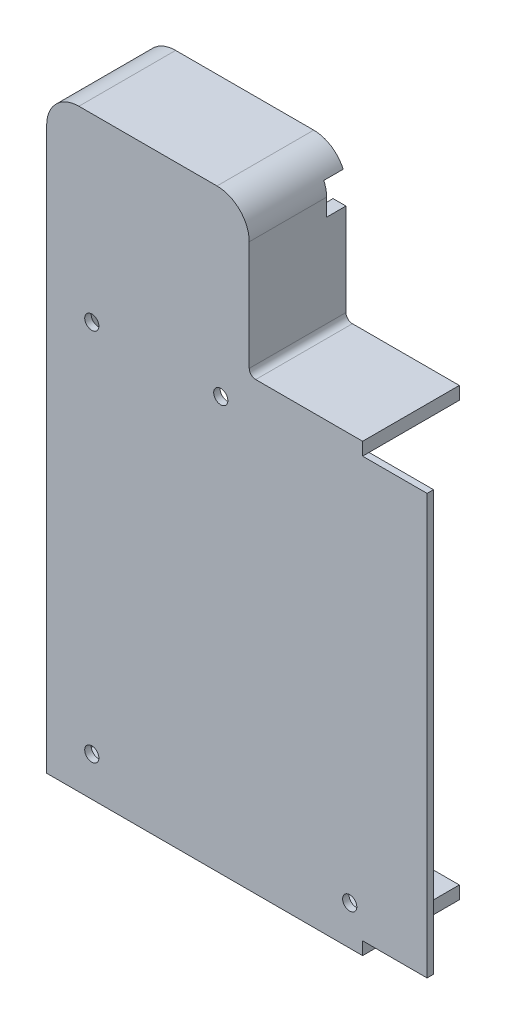
ISO-10303-21;
HEADER;
FILE_DESCRIPTION(('STEP AP214'),'2;1');
FILE_NAME('part.step','',(''),(''),'','','');
FILE_SCHEMA(('AUTOMOTIVE_DESIGN { 1 0 10303 214 1 1 1 1 }'));
ENDSEC;
DATA;
#1=APPLICATION_CONTEXT('core data for automotive mechanical design processes');
#2=APPLICATION_PROTOCOL_DEFINITION('international standard','automotive_design',2000,#1);
#3=PRODUCT_CONTEXT('',#1,'mechanical');
#4=PRODUCT('Part','Part','',(#3));
#5=PRODUCT_RELATED_PRODUCT_CATEGORY('part','',(#4));
#6=PRODUCT_DEFINITION_FORMATION('','',#4);
#7=PRODUCT_DEFINITION_CONTEXT('part definition',#1,'design');
#8=PRODUCT_DEFINITION('design','',#6,#7);
#9=PRODUCT_DEFINITION_SHAPE('','',#8);
#10=(LENGTH_UNIT() NAMED_UNIT(*) SI_UNIT(.MILLI.,.METRE.));
#11=(NAMED_UNIT(*) PLANE_ANGLE_UNIT() SI_UNIT($,.RADIAN.));
#12=(NAMED_UNIT(*) SI_UNIT($,.STERADIAN.) SOLID_ANGLE_UNIT());
#13=UNCERTAINTY_MEASURE_WITH_UNIT(LENGTH_MEASURE(1.E-05),#10,'distance_accuracy_value','');
#14=(GEOMETRIC_REPRESENTATION_CONTEXT(3) GLOBAL_UNCERTAINTY_ASSIGNED_CONTEXT((#13)) GLOBAL_UNIT_ASSIGNED_CONTEXT((#10,
#11,#12)) REPRESENTATION_CONTEXT('',''));
#15=CARTESIAN_POINT('',(0.,0.,0.));
#16=DIRECTION('',(0.,0.,1.));
#17=DIRECTION('',(1.,0.,0.));
#18=AXIS2_PLACEMENT_3D('',#15,#16,#17);
#19=CARTESIAN_POINT('',(817.066097304828,1120.58978903752,1318.47290301832));
#20=DIRECTION('',(-1.,0.,0.));
#21=DIRECTION('',(0.,0.,1.));
#22=AXIS2_PLACEMENT_3D('',#19,#20,#21);
#23=PLANE('',#22);
#24=DIRECTION('',(0.,0.,-1.));
#25=VECTOR('',#24,1.);
#26=CARTESIAN_POINT('',(817.066097304828,1117.89524788642,1318.47290301832));
#27=LINE('',#26,#25);
#28=CARTESIAN_POINT('',(817.066097304828,1117.89524788642,1306.47290301832));
#29=VERTEX_POINT('',#28);
#30=CARTESIAN_POINT('',(817.066097304828,1117.89524788642,1303.47290301832));
#31=VERTEX_POINT('',#30);
#32=EDGE_CURVE('E254',#29,#31,#27,.T.);
#33=ORIENTED_EDGE('',*,*,#32,.F.);
#34=DIRECTION('',(0.,1.,0.));
#35=VECTOR('',#34,1.);
#36=CARTESIAN_POINT('',(817.066097304828,1120.58978903752,1306.47290301832));
#37=LINE('',#36,#35);
#38=CARTESIAN_POINT('',(817.066097304828,1120.58978903752,1306.47290301832));
#39=VERTEX_POINT('',#38);
#40=EDGE_CURVE('E356',#29,#39,#37,.T.);
#41=ORIENTED_EDGE('',*,*,#40,.T.);
#42=DIRECTION('',(0.,0.,-1.));
#43=VECTOR('',#42,1.);
#44=CARTESIAN_POINT('',(817.066097304828,1120.58978903752,1318.47290301832));
#45=LINE('',#44,#43);
#46=CARTESIAN_POINT('',(817.066097304828,1120.58978903752,1318.47290301832));
#47=VERTEX_POINT('',#46);
#48=EDGE_CURVE('E289',#47,#39,#45,.T.);
#49=ORIENTED_EDGE('',*,*,#48,.F.);
#50=DIRECTION('',(0.,1.,0.));
#51=VECTOR('',#50,1.);
#52=CARTESIAN_POINT('',(817.066097304828,1120.58978903752,1318.47290301832));
#53=LINE('',#52,#51);
#54=CARTESIAN_POINT('',(817.066097304828,1103.58978903751,1318.47290301832));
#55=VERTEX_POINT('',#54);
#56=EDGE_CURVE('E448',#55,#47,#53,.T.);
#57=ORIENTED_EDGE('',*,*,#56,.F.);
#58=DIRECTION('',(0.,0.,-1.));
#59=VECTOR('',#58,1.);
#60=CARTESIAN_POINT('',(817.066097304828,1103.58978903751,1318.47290301832));
#61=LINE('',#60,#59);
#62=CARTESIAN_POINT('',(817.066097304828,1103.58978903751,1303.47290301832));
#63=VERTEX_POINT('',#62);
#64=EDGE_CURVE('E292',#55,#63,#61,.T.);
#65=ORIENTED_EDGE('',*,*,#64,.T.);
#66=DIRECTION('',(0.,1.,0.));
#67=VECTOR('',#66,1.);
#68=CARTESIAN_POINT('',(817.066097304828,1120.58978903752,1303.47290301832));
#69=LINE('',#68,#67);
#70=EDGE_CURVE('E466',#63,#31,#69,.T.);
#71=ORIENTED_EDGE('',*,*,#70,.T.);
#72=EDGE_LOOP('',(#33,#41,#49,#57,#65,#71));
#73=FACE_BOUND('',#72,.T.);
#74=ADVANCED_FACE('F41',(#73),#23,.F.);
#75=CARTESIAN_POINT('',(812.065003168395,1120.58833023332,1318.47290301832));
#76=DIRECTION('',(0.,0.,-1.));
#77=DIRECTION('',(-1.,0.,0.));
#78=AXIS2_PLACEMENT_3D('',#75,#76,#77);
#79=CYLINDRICAL_SURFACE('',#78,5.00109434919731);
#80=DIRECTION('',(0.,0.,-1.));
#81=VECTOR('',#80,1.);
#82=CARTESIAN_POINT('',(816.636331762786,1122.616605257,1318.47290301832));
#83=LINE('',#82,#81);
#84=CARTESIAN_POINT('',(816.636331762786,1122.616605257,1303.47290301832));
#85=VERTEX_POINT('',#84);
#86=CARTESIAN_POINT('',(816.636331762786,1122.616605257,1306.47290301832));
#87=VERTEX_POINT('',#86);
#88=EDGE_CURVE('E359',#85,#87,#83,.F.);
#89=ORIENTED_EDGE('',*,*,#88,.F.);
#90=CARTESIAN_POINT('',(812.065003168395,1120.58833023332,1303.47290301832));
#91=DIRECTION('',(0.,0.,1.));
#92=DIRECTION('',(1.,0.,0.));
#93=AXIS2_PLACEMENT_3D('',#90,#91,#92);
#94=CIRCLE('',#93,5.00109434919731);
#95=CARTESIAN_POINT('',(812.066461972588,1125.58942436976,1303.47290301832));
#96=VERTEX_POINT('',#95);
#97=EDGE_CURVE('E469',#85,#96,#94,.T.);
#98=ORIENTED_EDGE('',*,*,#97,.T.);
#99=DIRECTION('',(0.,0.,-1.));
#100=VECTOR('',#99,1.);
#101=CARTESIAN_POINT('',(812.066461972588,1125.58942436976,1318.47290301832));
#102=LINE('',#101,#100);
#103=CARTESIAN_POINT('',(812.066461972588,1125.58942436976,1318.47290301832));
#104=VERTEX_POINT('',#103);
#105=EDGE_CURVE('E286',#104,#96,#102,.T.);
#106=ORIENTED_EDGE('',*,*,#105,.F.);
#107=CARTESIAN_POINT('',(812.065003168395,1120.58833023332,1318.47290301832));
#108=DIRECTION('',(0.,0.,1.));
#109=DIRECTION('',(1.,0.,0.));
#110=AXIS2_PLACEMENT_3D('',#107,#108,#109);
#111=CIRCLE('',#110,5.00109434919731);
#112=EDGE_CURVE('E450',#47,#104,#111,.T.);
#113=ORIENTED_EDGE('',*,*,#112,.F.);
#114=ORIENTED_EDGE('',*,*,#48,.T.);
#115=CARTESIAN_POINT('',(812.065003168395,1120.58833023332,1306.47290301832));
#116=DIRECTION('',(0.,0.,1.));
#117=DIRECTION('',(1.,0.,0.));
#118=AXIS2_PLACEMENT_3D('',#115,#116,#117);
#119=CIRCLE('',#118,5.00109434919731);
#120=EDGE_CURVE('E353',#39,#87,#119,.T.);
#121=ORIENTED_EDGE('',*,*,#120,.T.);
#122=EDGE_LOOP('',(#89,#98,#106,#113,#114,#121));
#123=FACE_BOUND('',#122,.T.);
#124=ADVANCED_FACE('F519',(#123),#79,.T.);
#125=CARTESIAN_POINT('',(790.651191574185,1120.58833023332,1318.47290301832));
#126=DIRECTION('',(0.,0.,-1.));
#127=DIRECTION('',(-1.,0.,0.));
#128=AXIS2_PLACEMENT_3D('',#125,#126,#127);
#129=CYLINDRICAL_SURFACE('',#128,5.00109434919231);
#130=DIRECTION('',(0.,0.,-1.));
#131=VECTOR('',#130,1.);
#132=CARTESIAN_POINT('',(786.0798629798,1122.616605257,1318.47290301832));
#133=LINE('',#132,#131);
#134=CARTESIAN_POINT('',(786.0798629798,1122.616605257,1306.47290301832));
#135=VERTEX_POINT('',#134);
#136=CARTESIAN_POINT('',(786.0798629798,1122.616605257,1303.47290301832));
#137=VERTEX_POINT('',#136);
#138=EDGE_CURVE('E350',#135,#137,#133,.T.);
#139=ORIENTED_EDGE('',*,*,#138,.F.);
#140=CARTESIAN_POINT('',(790.651191574185,1120.58833023332,1306.47290301832));
#141=DIRECTION('',(0.,0.,-1.));
#142=DIRECTION('',(-1.,0.,0.));
#143=AXIS2_PLACEMENT_3D('',#140,#141,#142);
#144=CIRCLE('',#143,5.00109434919231);
#145=CARTESIAN_POINT('',(785.65009743776,1120.58978903752,1306.47290301832));
#146=VERTEX_POINT('',#145);
#147=EDGE_CURVE('E348',#146,#135,#144,.T.);
#148=ORIENTED_EDGE('',*,*,#147,.F.);
#149=DIRECTION('',(0.,0.,-1.));
#150=VECTOR('',#149,1.);
#151=CARTESIAN_POINT('',(785.65009743776,1120.58978903752,1318.47290301832));
#152=LINE('',#151,#150);
#153=CARTESIAN_POINT('',(785.65009743776,1120.58978903752,1318.47290301832));
#154=VERTEX_POINT('',#153);
#155=EDGE_CURVE('E281',#154,#146,#152,.T.);
#156=ORIENTED_EDGE('',*,*,#155,.F.);
#157=CARTESIAN_POINT('',(790.651191574185,1120.58833023332,1318.47290301832));
#158=DIRECTION('',(0.,0.,1.));
#159=DIRECTION('',(1.,0.,0.));
#160=AXIS2_PLACEMENT_3D('',#157,#158,#159);
#161=CIRCLE('',#160,5.00109434919231);
#162=CARTESIAN_POINT('',(790.649732770005,1125.58942436975,1318.47290301832));
#163=VERTEX_POINT('',#162);
#164=EDGE_CURVE('E454',#163,#154,#161,.T.);
#165=ORIENTED_EDGE('',*,*,#164,.F.);
#166=DIRECTION('',(0.,0.,-1.));
#167=VECTOR('',#166,1.);
#168=CARTESIAN_POINT('',(790.649732770005,1125.58942436975,1318.47290301832));
#169=LINE('',#168,#167);
#170=CARTESIAN_POINT('',(790.649732770005,1125.58942436975,1303.47290301832));
#171=VERTEX_POINT('',#170);
#172=EDGE_CURVE('E283',#163,#171,#169,.T.);
#173=ORIENTED_EDGE('',*,*,#172,.T.);
#174=CARTESIAN_POINT('',(790.651191574185,1120.58833023332,1303.47290301832));
#175=DIRECTION('',(0.,0.,1.));
#176=DIRECTION('',(1.,0.,0.));
#177=AXIS2_PLACEMENT_3D('',#174,#175,#176);
#178=CIRCLE('',#177,5.00109434919231);
#179=EDGE_CURVE('E260',#171,#137,#178,.T.);
#180=ORIENTED_EDGE('',*,*,#179,.T.);
#181=EDGE_LOOP('',(#139,#148,#156,#165,#173,#180));
#182=FACE_BOUND('',#181,.T.);
#183=ADVANCED_FACE('F482',(#182),#129,.T.);
#184=CARTESIAN_POINT('',(785.650097371295,1033.49652121042,1318.47290301832));
#185=DIRECTION('',(1.,-7.63142929992677E-10,0.));
#186=DIRECTION('',(7.63142929992677E-10,1.,0.));
#187=AXIS2_PLACEMENT_3D('',#184,#185,#186);
#188=PLANE('',#187);
#189=DIRECTION('',(0.,0.,1.));
#190=VECTOR('',#189,1.);
#191=CARTESIAN_POINT('',(785.650097435704,1117.89524788642,1318.47290301832));
#192=LINE('',#191,#190);
#193=CARTESIAN_POINT('',(785.650097371295,1117.89524788642,1303.47290301832));
#194=VERTEX_POINT('',#193);
#195=CARTESIAN_POINT('',(785.650097436732,1117.89524788642,1306.47290301832));
#196=VERTEX_POINT('',#195);
#197=EDGE_CURVE('E238',#194,#196,#192,.T.);
#198=ORIENTED_EDGE('',*,*,#197,.F.);
#199=DIRECTION('',(-7.63142929992677E-10,-1.,0.));
#200=VECTOR('',#199,1.);
#201=CARTESIAN_POINT('',(785.650097371295,1033.49652121042,1303.47290301832));
#202=LINE('',#201,#200);
#203=CARTESIAN_POINT('',(785.650097371295,1033.49652121042,1303.47290301832));
#204=VERTEX_POINT('',#203);
#205=EDGE_CURVE('E249',#194,#204,#202,.T.);
#206=ORIENTED_EDGE('',*,*,#205,.T.);
#207=DIRECTION('',(0.,0.,-1.));
#208=VECTOR('',#207,1.);
#209=CARTESIAN_POINT('',(785.650097371295,1033.49652121042,1318.47290301832));
#210=LINE('',#209,#208);
#211=CARTESIAN_POINT('',(785.650097371295,1033.49652121042,1318.47290301832));
#212=VERTEX_POINT('',#211);
#213=EDGE_CURVE('E279',#212,#204,#210,.T.);
#214=ORIENTED_EDGE('',*,*,#213,.F.);
#215=DIRECTION('',(-7.63142929992677E-10,-1.,0.));
#216=VECTOR('',#215,1.);
#217=CARTESIAN_POINT('',(785.650097371295,1033.49652121042,1318.47290301832));
#218=LINE('',#217,#216);
#219=EDGE_CURVE('E456',#154,#212,#218,.T.);
#220=ORIENTED_EDGE('',*,*,#219,.F.);
#221=ORIENTED_EDGE('',*,*,#155,.T.);
#222=DIRECTION('',(7.63142929992677E-10,1.,0.));
#223=VECTOR('',#222,1.);
#224=CARTESIAN_POINT('',(785.650097371295,1033.49652121042,1306.47290301832));
#225=LINE('',#224,#223);
#226=EDGE_CURVE('E252',#196,#146,#225,.T.);
#227=ORIENTED_EDGE('',*,*,#226,.F.);
#228=EDGE_LOOP('',(#198,#206,#214,#220,#221,#227));
#229=FACE_BOUND('',#228,.T.);
#230=ADVANCED_FACE('F247',(#229),#188,.F.);
#231=CARTESIAN_POINT('',(790.651191574185,1120.58833023332,1303.47290301832));
#232=DIRECTION('',(0.,0.,1.));
#233=DIRECTION('',(1.,0.,0.));
#234=AXIS2_PLACEMENT_3D('',#231,#232,#233);
#235=PLANE('',#234);
#236=DIRECTION('',(-1.,0.,0.));
#237=VECTOR('',#236,1.);
#238=CARTESIAN_POINT('',(791.526705461344,1122.616605257,1303.47290301832));
#239=LINE('',#238,#237);
#240=CARTESIAN_POINT('',(788.439253952946,1122.616605257,1303.47290301832));
#241=VERTEX_POINT('',#240);
#242=EDGE_CURVE('E243',#241,#137,#239,.T.);
#243=ORIENTED_EDGE('',*,*,#242,.T.);
#244=ORIENTED_EDGE('',*,*,#179,.F.);
#245=DIRECTION('',(-1.,-1.14045923215985E-13,0.));
#246=VECTOR('',#245,1.);
#247=CARTESIAN_POINT('',(790.649732770005,1125.58942436975,1303.47290301832));
#248=LINE('',#247,#246);
#249=EDGE_CURVE('E265',#96,#171,#248,.T.);
#250=ORIENTED_EDGE('',*,*,#249,.F.);
#251=ORIENTED_EDGE('',*,*,#97,.F.);
#252=DIRECTION('',(-1.,0.,0.));
#253=VECTOR('',#252,1.);
#254=CARTESIAN_POINT('',(809.844363200608,1122.616605257,1303.47290301832));
#255=LINE('',#254,#253);
#256=CARTESIAN_POINT('',(814.276940789641,1122.616605257,1303.47290301832));
#257=VERTEX_POINT('',#256);
#258=EDGE_CURVE('E337',#85,#257,#255,.T.);
#259=ORIENTED_EDGE('',*,*,#258,.T.);
#260=CARTESIAN_POINT('',(812.065003168395,1120.58833023332,1303.47290301832));
#261=DIRECTION('',(0.,0.,1.));
#262=DIRECTION('',(1.,0.,0.));
#263=AXIS2_PLACEMENT_3D('',#260,#261,#262);
#264=CIRCLE('',#263,3.00109440237386);
#265=CARTESIAN_POINT('',(812.066097371295,1123.58942443622,1303.47290301832));
#266=VERTEX_POINT('',#265);
#267=EDGE_CURVE('E401',#257,#266,#264,.T.);
#268=ORIENTED_EDGE('',*,*,#267,.T.);
#269=DIRECTION('',(-1.,-2.28099612829224E-13,0.));
#270=VECTOR('',#269,1.);
#271=CARTESIAN_POINT('',(790.650097371295,1123.58942443622,1303.47290301832));
#272=LINE('',#271,#270);
#273=CARTESIAN_POINT('',(790.650097371295,1123.58942443622,1303.47290301832));
#274=VERTEX_POINT('',#273);
#275=EDGE_CURVE('E403',#266,#274,#272,.T.);
#276=ORIENTED_EDGE('',*,*,#275,.T.);
#277=CARTESIAN_POINT('',(790.651191574185,1120.58833023332,1303.47290301832));
#278=DIRECTION('',(0.,0.,1.));
#279=DIRECTION('',(1.,0.,0.));
#280=AXIS2_PLACEMENT_3D('',#277,#278,#279);
#281=CIRCLE('',#280,3.00109440236892);
#282=EDGE_CURVE('E366',#274,#241,#281,.T.);
#283=ORIENTED_EDGE('',*,*,#282,.T.);
#284=EDGE_LOOP('',(#243,#244,#250,#251,#259,#268,#276,#283));
#285=FACE_BOUND('',#284,.T.);
#286=ADVANCED_FACE('F485',(#285),#235,.F.);
#287=DIRECTION('',(1.,0.,0.));
#288=VECTOR('',#287,1.);
#289=CARTESIAN_POINT('',(791.526705461344,1117.89524788642,1303.47290301832));
#290=LINE('',#289,#288);
#291=CARTESIAN_POINT('',(787.65009737129,1117.89524788642,1303.47290301832));
#292=VERTEX_POINT('',#291);
#293=EDGE_CURVE('E234',#194,#292,#290,.T.);
#294=ORIENTED_EDGE('',*,*,#293,.T.);
#295=DIRECTION('',(0.,-1.,0.));
#296=VECTOR('',#295,1.);
#297=CARTESIAN_POINT('',(787.650097371295,1035.49652121042,1303.47290301832));
#298=LINE('',#297,#296);
#299=CARTESIAN_POINT('',(787.650097371295,1035.49652121042,1303.47290301832));
#300=VERTEX_POINT('',#299);
#301=EDGE_CURVE('E253',#292,#300,#298,.T.);
#302=ORIENTED_EDGE('',*,*,#301,.T.);
#303=DIRECTION('',(1.,0.,0.));
#304=VECTOR('',#303,1.);
#305=CARTESIAN_POINT('',(834.649003168395,1035.49652121042,1303.47290301832));
#306=LINE('',#305,#304);
#307=CARTESIAN_POINT('',(834.649003168395,1035.49652121042,1303.47290301832));
#308=VERTEX_POINT('',#307);
#309=EDGE_CURVE('E389',#300,#308,#306,.T.);
#310=ORIENTED_EDGE('',*,*,#309,.T.);
#311=DIRECTION('',(0.,1.,0.));
#312=VECTOR('',#311,1.);
#313=CARTESIAN_POINT('',(834.649003168395,1035.49652121042,1303.47290301832));
#314=LINE('',#313,#312);
#315=CARTESIAN_POINT('',(834.649003168395,1033.49652121042,1303.47290301832));
#316=VERTEX_POINT('',#315);
#317=EDGE_CURVE('E262',#316,#308,#314,.T.);
#318=ORIENTED_EDGE('',*,*,#317,.F.);
#319=DIRECTION('',(1.,0.,0.));
#320=VECTOR('',#319,1.);
#321=CARTESIAN_POINT('',(785.650097371295,1033.49652121042,1303.47290301832));
#322=LINE('',#321,#320);
#323=EDGE_CURVE('E259',#204,#316,#322,.T.);
#324=ORIENTED_EDGE('',*,*,#323,.F.);
#325=ORIENTED_EDGE('',*,*,#205,.F.);
#326=EDGE_LOOP('',(#294,#302,#310,#318,#324,#325));
#327=FACE_BOUND('',#326,.T.);
#328=ADVANCED_FACE('F257',(#327),#235,.F.);
#329=DIRECTION('',(1.,0.,0.));
#330=VECTOR('',#329,1.);
#331=CARTESIAN_POINT('',(809.844363200608,1117.89524788642,1303.47290301832));
#332=LINE('',#331,#330);
#333=CARTESIAN_POINT('',(815.066097371295,1117.89524788642,1303.47290301832));
#334=VERTEX_POINT('',#333);
#335=EDGE_CURVE('E340',#334,#31,#332,.T.);
#336=ORIENTED_EDGE('',*,*,#335,.T.);
#337=ORIENTED_EDGE('',*,*,#70,.F.);
#338=CARTESIAN_POINT('',(818.067191574185,1103.59051863911,1303.47290301832));
#339=DIRECTION('',(0.,0.,-1.));
#340=DIRECTION('',(1.,0.,0.));
#341=AXIS2_PLACEMENT_3D('',#338,#339,#340);
#342=CIRCLE('',#341,1.00109453522535);
#343=CARTESIAN_POINT('',(818.066461972585,1102.58942436976,1303.47290301832));
#344=VERTEX_POINT('',#343);
#345=EDGE_CURVE('E464',#344,#63,#342,.T.);
#346=ORIENTED_EDGE('',*,*,#345,.F.);
#347=DIRECTION('',(-1.,0.,0.));
#348=VECTOR('',#347,1.);
#349=CARTESIAN_POINT('',(818.066461972585,1102.58942436976,1303.47290301832));
#350=LINE('',#349,#348);
#351=CARTESIAN_POINT('',(834.650461972588,1102.58942436976,1303.47290301832));
#352=VERTEX_POINT('',#351);
#353=EDGE_CURVE('E462',#352,#344,#350,.T.);
#354=ORIENTED_EDGE('',*,*,#353,.F.);
#355=DIRECTION('',(0.000182300649607673,0.999999983383236,0.));
#356=VECTOR('',#355,1.);
#357=CARTESIAN_POINT('',(834.650461972588,1102.58942436976,1303.47290301832));
#358=LINE('',#357,#356);
#359=CARTESIAN_POINT('',(834.650097371295,1100.58942443622,1303.47290301832));
#360=VERTEX_POINT('',#359);
#361=EDGE_CURVE('E442',#360,#352,#358,.T.);
#362=ORIENTED_EDGE('',*,*,#361,.F.);
#363=DIRECTION('',(-1.,0.,0.));
#364=VECTOR('',#363,1.);
#365=CARTESIAN_POINT('',(818.066097371295,1100.58942443622,1303.47290301832));
#366=LINE('',#365,#364);
#367=CARTESIAN_POINT('',(818.066097371295,1100.58942443622,1303.47290301832));
#368=VERTEX_POINT('',#367);
#369=EDGE_CURVE('E392',#360,#368,#366,.T.);
#370=ORIENTED_EDGE('',*,*,#369,.T.);
#371=CARTESIAN_POINT('',(818.067191574185,1103.59051863911,1303.47290301832));
#372=DIRECTION('',(0.,0.,-1.));
#373=DIRECTION('',(1.,0.,0.));
#374=AXIS2_PLACEMENT_3D('',#371,#372,#373);
#375=CIRCLE('',#374,3.00109440236392);
#376=CARTESIAN_POINT('',(815.066097371295,1103.58942443622,1303.47290301832));
#377=VERTEX_POINT('',#376);
#378=EDGE_CURVE('E395',#368,#377,#375,.T.);
#379=ORIENTED_EDGE('',*,*,#378,.T.);
#380=DIRECTION('',(0.,1.,0.));
#381=VECTOR('',#380,1.);
#382=CARTESIAN_POINT('',(815.066097371295,1120.58942443622,1303.47290301832));
#383=LINE('',#382,#381);
#384=EDGE_CURVE('E398',#377,#334,#383,.T.);
#385=ORIENTED_EDGE('',*,*,#384,.T.);
#386=EDGE_LOOP('',(#336,#337,#346,#354,#362,#370,#379,#385));
#387=FACE_BOUND('',#386,.T.);
#388=ADVANCED_FACE('F580',(#387),#235,.F.);
#389=CARTESIAN_POINT('',(787.650097371295,1035.49652121042,1317.47290301832));
#390=DIRECTION('',(1.,0.,0.));
#391=DIRECTION('',(0.,1.,0.));
#392=AXIS2_PLACEMENT_3D('',#389,#390,#391);
#393=PLANE('',#392);
#394=ORIENTED_EDGE('',*,*,#301,.F.);
#395=DIRECTION('',(0.,0.,1.));
#396=VECTOR('',#395,1.);
#397=CARTESIAN_POINT('',(787.65009737129,1117.89524788642,1317.47290301832));
#398=LINE('',#397,#396);
#399=CARTESIAN_POINT('',(787.65009737129,1117.89524788642,1306.47290301832));
#400=VERTEX_POINT('',#399);
#401=EDGE_CURVE('E11',#292,#400,#398,.T.);
#402=ORIENTED_EDGE('',*,*,#401,.T.);
#403=DIRECTION('',(0.,1.,0.));
#404=VECTOR('',#403,1.);
#405=CARTESIAN_POINT('',(787.650097371295,1035.49652121042,1306.47290301832));
#406=LINE('',#405,#404);
#407=CARTESIAN_POINT('',(787.65009737129,1120.58942443622,1306.47290301832));
#408=VERTEX_POINT('',#407);
#409=EDGE_CURVE('E343',#400,#408,#406,.T.);
#410=ORIENTED_EDGE('',*,*,#409,.T.);
#411=DIRECTION('',(0.,0.,-1.));
#412=VECTOR('',#411,1.);
#413=CARTESIAN_POINT('',(787.65009737129,1120.58942443622,1317.47290301832));
#414=LINE('',#413,#412);
#415=CARTESIAN_POINT('',(787.65009737129,1120.58942443622,1317.47290301832));
#416=VERTEX_POINT('',#415);
#417=EDGE_CURVE('E387',#416,#408,#414,.T.);
#418=ORIENTED_EDGE('',*,*,#417,.F.);
#419=DIRECTION('',(0.,-1.,0.));
#420=VECTOR('',#419,1.);
#421=CARTESIAN_POINT('',(787.650097371295,1035.49652121042,1317.47290301832));
#422=LINE('',#421,#420);
#423=CARTESIAN_POINT('',(787.650097371295,1035.49652121042,1317.47290301832));
#424=VERTEX_POINT('',#423);
#425=EDGE_CURVE('E362',#416,#424,#422,.T.);
#426=ORIENTED_EDGE('',*,*,#425,.T.);
#427=DIRECTION('',(0.,0.,-1.));
#428=VECTOR('',#427,1.);
#429=CARTESIAN_POINT('',(787.650097371295,1035.49652121042,1317.47290301832));
#430=LINE('',#429,#428);
#431=EDGE_CURVE('E422',#424,#300,#430,.T.);
#432=ORIENTED_EDGE('',*,*,#431,.T.);
#433=EDGE_LOOP('',(#394,#402,#410,#418,#426,#432));
#434=FACE_BOUND('',#433,.T.);
#435=ADVANCED_FACE('F534',(#434),#393,.T.);
#436=CARTESIAN_POINT('',(815.066097371295,1120.58942443622,1317.47290301832));
#437=DIRECTION('',(-1.,0.,0.));
#438=DIRECTION('',(0.,0.,1.));
#439=AXIS2_PLACEMENT_3D('',#436,#437,#438);
#440=PLANE('',#439);
#441=DIRECTION('',(0.,1.,0.));
#442=VECTOR('',#441,1.);
#443=CARTESIAN_POINT('',(815.066097371295,1120.58942443622,1306.47290301832));
#444=LINE('',#443,#442);
#445=CARTESIAN_POINT('',(815.066097371295,1117.89524788642,1306.47290301832));
#446=VERTEX_POINT('',#445);
#447=CARTESIAN_POINT('',(815.066097371295,1120.58942443622,1306.47290301832));
#448=VERTEX_POINT('',#447);
#449=EDGE_CURVE('E58',#446,#448,#444,.T.);
#450=ORIENTED_EDGE('',*,*,#449,.F.);
#451=DIRECTION('',(0.,0.,-1.));
#452=VECTOR('',#451,1.);
#453=CARTESIAN_POINT('',(815.066097371295,1117.89524788642,1317.47290301832));
#454=LINE('',#453,#452);
#455=EDGE_CURVE('E50',#446,#334,#454,.T.);
#456=ORIENTED_EDGE('',*,*,#455,.T.);
#457=ORIENTED_EDGE('',*,*,#384,.F.);
#458=DIRECTION('',(0.,0.,-1.));
#459=VECTOR('',#458,1.);
#460=CARTESIAN_POINT('',(815.066097371295,1103.58942443622,1317.47290301832));
#461=LINE('',#460,#459);
#462=CARTESIAN_POINT('',(815.066097371295,1103.58942443622,1317.47290301832));
#463=VERTEX_POINT('',#462);
#464=EDGE_CURVE('E418',#463,#377,#461,.T.);
#465=ORIENTED_EDGE('',*,*,#464,.F.);
#466=DIRECTION('',(0.,1.,0.));
#467=VECTOR('',#466,1.);
#468=CARTESIAN_POINT('',(815.066097371295,1120.58942443622,1317.47290301832));
#469=LINE('',#468,#467);
#470=CARTESIAN_POINT('',(815.066097371295,1120.58942443622,1317.47290301832));
#471=VERTEX_POINT('',#470);
#472=EDGE_CURVE('E379',#463,#471,#469,.T.);
#473=ORIENTED_EDGE('',*,*,#472,.T.);
#474=DIRECTION('',(0.,0.,-1.));
#475=VECTOR('',#474,1.);
#476=CARTESIAN_POINT('',(815.066097371295,1120.58942443622,1317.47290301832));
#477=LINE('',#476,#475);
#478=EDGE_CURVE('E415',#471,#448,#477,.T.);
#479=ORIENTED_EDGE('',*,*,#478,.T.);
#480=EDGE_LOOP('',(#450,#456,#457,#465,#473,#479));
#481=FACE_BOUND('',#480,.T.);
#482=ADVANCED_FACE('F523',(#481),#440,.T.);
#483=CARTESIAN_POINT('',(812.065003168395,1120.58833023332,1317.47290301832));
#484=DIRECTION('',(0.,0.,-1.));
#485=DIRECTION('',(-1.,0.,0.));
#486=AXIS2_PLACEMENT_3D('',#483,#484,#485);
#487=CYLINDRICAL_SURFACE('',#486,3.00109440237386);
#488=ORIENTED_EDGE('',*,*,#267,.F.);
#489=DIRECTION('',(0.,0.,-1.));
#490=VECTOR('',#489,1.);
#491=CARTESIAN_POINT('',(814.276940789641,1122.616605257,1317.47290301832));
#492=LINE('',#491,#490);
#493=CARTESIAN_POINT('',(814.276940789641,1122.616605257,1306.47290301832));
#494=VERTEX_POINT('',#493);
#495=EDGE_CURVE('E312',#257,#494,#492,.F.);
#496=ORIENTED_EDGE('',*,*,#495,.T.);
#497=CARTESIAN_POINT('',(812.065003168395,1120.58833023332,1306.47290301832));
#498=DIRECTION('',(0.,0.,1.));
#499=DIRECTION('',(1.,0.,0.));
#500=AXIS2_PLACEMENT_3D('',#497,#498,#499);
#501=CIRCLE('',#500,3.00109440237386);
#502=EDGE_CURVE('E310',#448,#494,#501,.T.);
#503=ORIENTED_EDGE('',*,*,#502,.F.);
#504=ORIENTED_EDGE('',*,*,#478,.F.);
#505=CARTESIAN_POINT('',(812.065003168395,1120.58833023332,1317.47290301832));
#506=DIRECTION('',(0.,0.,1.));
#507=DIRECTION('',(1.,0.,0.));
#508=AXIS2_PLACEMENT_3D('',#505,#506,#507);
#509=CIRCLE('',#508,3.00109440237386);
#510=CARTESIAN_POINT('',(812.066097371295,1123.58942443622,1317.47290301832));
#511=VERTEX_POINT('',#510);
#512=EDGE_CURVE('E381',#471,#511,#509,.T.);
#513=ORIENTED_EDGE('',*,*,#512,.T.);
#514=DIRECTION('',(0.,0.,-1.));
#515=VECTOR('',#514,1.);
#516=CARTESIAN_POINT('',(812.066097371295,1123.58942443622,1317.47290301832));
#517=LINE('',#516,#515);
#518=EDGE_CURVE('E412',#511,#266,#517,.T.);
#519=ORIENTED_EDGE('',*,*,#518,.T.);
#520=EDGE_LOOP('',(#488,#496,#503,#504,#513,#519));
#521=FACE_BOUND('',#520,.T.);
#522=ADVANCED_FACE('F496',(#521),#487,.F.);
#523=CARTESIAN_POINT('',(790.651191574185,1120.58833023332,1317.47290301832));
#524=DIRECTION('',(0.,0.,-1.));
#525=DIRECTION('',(-1.,0.,0.));
#526=AXIS2_PLACEMENT_3D('',#523,#524,#525);
#527=CYLINDRICAL_SURFACE('',#526,3.00109440236892);
#528=CARTESIAN_POINT('',(790.651191574185,1120.58833023332,1306.47290301832));
#529=DIRECTION('',(0.,0.,-1.));
#530=DIRECTION('',(-1.,0.,0.));
#531=AXIS2_PLACEMENT_3D('',#528,#529,#530);
#532=CIRCLE('',#531,3.00109440236892);
#533=CARTESIAN_POINT('',(788.439253952946,1122.616605257,1306.47290301832));
#534=VERTEX_POINT('',#533);
#535=EDGE_CURVE('E304',#408,#534,#532,.T.);
#536=ORIENTED_EDGE('',*,*,#535,.T.);
#537=DIRECTION('',(0.,0.,-1.));
#538=VECTOR('',#537,1.);
#539=CARTESIAN_POINT('',(788.439253952946,1122.616605257,1317.47290301832));
#540=LINE('',#539,#538);
#541=EDGE_CURVE('E307',#534,#241,#540,.T.);
#542=ORIENTED_EDGE('',*,*,#541,.T.);
#543=ORIENTED_EDGE('',*,*,#282,.F.);
#544=DIRECTION('',(0.,0.,-1.));
#545=VECTOR('',#544,1.);
#546=CARTESIAN_POINT('',(790.650097371295,1123.58942443622,1317.47290301832));
#547=LINE('',#546,#545);
#548=CARTESIAN_POINT('',(790.650097371295,1123.58942443622,1317.47290301832));
#549=VERTEX_POINT('',#548);
#550=EDGE_CURVE('E410',#549,#274,#547,.T.);
#551=ORIENTED_EDGE('',*,*,#550,.F.);
#552=CARTESIAN_POINT('',(790.651191574185,1120.58833023332,1317.47290301832));
#553=DIRECTION('',(0.,0.,1.));
#554=DIRECTION('',(1.,0.,0.));
#555=AXIS2_PLACEMENT_3D('',#552,#553,#554);
#556=CIRCLE('',#555,3.00109440236892);
#557=EDGE_CURVE('E385',#549,#416,#556,.T.);
#558=ORIENTED_EDGE('',*,*,#557,.T.);
#559=ORIENTED_EDGE('',*,*,#417,.T.);
#560=EDGE_LOOP('',(#536,#542,#543,#551,#558,#559));
#561=FACE_BOUND('',#560,.T.);
#562=ADVANCED_FACE('F507',(#561),#527,.F.);
#563=CARTESIAN_POINT('',(834.650461972588,1102.58942436976,1318.47290301832));
#564=DIRECTION('',(-0.999999983383236,0.000182300649607673,0.));
#565=DIRECTION('',(-0.000182300649607673,-0.999999983383237,0.));
#566=AXIS2_PLACEMENT_3D('',#563,#564,#565);
#567=PLANE('',#566);
#568=ORIENTED_EDGE('',*,*,#361,.T.);
#569=DIRECTION('',(0.,0.,-1.));
#570=VECTOR('',#569,1.);
#571=CARTESIAN_POINT('',(834.650461972588,1102.58942436976,1318.47290301832));
#572=LINE('',#571,#570);
#573=CARTESIAN_POINT('',(834.650461972588,1102.58942436976,1318.47290301832));
#574=VERTEX_POINT('',#573);
#575=EDGE_CURVE('E298',#574,#352,#572,.T.);
#576=ORIENTED_EDGE('',*,*,#575,.F.);
#577=DIRECTION('',(0.000182300649607673,0.999999983383236,0.));
#578=VECTOR('',#577,1.);
#579=CARTESIAN_POINT('',(834.650461972588,1102.58942436976,1318.47290301832));
#580=LINE('',#579,#578);
#581=CARTESIAN_POINT('',(834.650097371295,1100.58942443622,1318.47290301832));
#582=VERTEX_POINT('',#581);
#583=EDGE_CURVE('E271',#582,#574,#580,.T.);
#584=ORIENTED_EDGE('',*,*,#583,.F.);
#585=DIRECTION('',(0.,0.,-1.));
#586=VECTOR('',#585,1.);
#587=CARTESIAN_POINT('',(834.650097371295,1100.58942443622,1318.47290301832));
#588=LINE('',#587,#586);
#589=CARTESIAN_POINT('',(834.650097371295,1100.58942443622,1317.47290301832));
#590=VERTEX_POINT('',#589);
#591=EDGE_CURVE('E301',#582,#590,#588,.T.);
#592=ORIENTED_EDGE('',*,*,#591,.T.);
#593=DIRECTION('',(0.,0.,1.));
#594=VECTOR('',#593,1.);
#595=CARTESIAN_POINT('',(834.650097371295,1100.58942443622,1318.47290301832));
#596=LINE('',#595,#594);
#597=EDGE_CURVE('E425',#360,#590,#596,.T.);
#598=ORIENTED_EDGE('',*,*,#597,.F.);
#599=EDGE_LOOP('',(#568,#576,#584,#592,#598));
#600=FACE_BOUND('',#599,.T.);
#601=ADVANCED_FACE('F43',(#600),#567,.F.);
#602=CARTESIAN_POINT('',(818.066461972585,1102.58942436976,1318.47290301832));
#603=DIRECTION('',(0.,-1.,0.));
#604=DIRECTION('',(0.,0.,-1.));
#605=AXIS2_PLACEMENT_3D('',#602,#603,#604);
#606=PLANE('',#605);
#607=ORIENTED_EDGE('',*,*,#353,.T.);
#608=DIRECTION('',(0.,0.,-1.));
#609=VECTOR('',#608,1.);
#610=CARTESIAN_POINT('',(818.066461972585,1102.58942436976,1318.47290301832));
#611=LINE('',#610,#609);
#612=CARTESIAN_POINT('',(818.066461972585,1102.58942436976,1318.47290301832));
#613=VERTEX_POINT('',#612);
#614=EDGE_CURVE('E295',#613,#344,#611,.T.);
#615=ORIENTED_EDGE('',*,*,#614,.F.);
#616=DIRECTION('',(-1.,0.,0.));
#617=VECTOR('',#616,1.);
#618=CARTESIAN_POINT('',(818.066461972585,1102.58942436976,1318.47290301832));
#619=LINE('',#618,#617);
#620=EDGE_CURVE('E444',#574,#613,#619,.T.);
#621=ORIENTED_EDGE('',*,*,#620,.F.);
#622=ORIENTED_EDGE('',*,*,#575,.T.);
#623=EDGE_LOOP('',(#607,#615,#621,#622));
#624=FACE_BOUND('',#623,.T.);
#625=ADVANCED_FACE('F562',(#624),#606,.F.);
#626=CARTESIAN_POINT('',(818.067191574185,1103.59051863911,1318.47290301832));
#627=DIRECTION('',(0.,0.,-1.));
#628=DIRECTION('',(-1.,0.,0.));
#629=AXIS2_PLACEMENT_3D('',#626,#627,#628);
#630=CYLINDRICAL_SURFACE('',#629,1.00109453522535);
#631=ORIENTED_EDGE('',*,*,#345,.T.);
#632=ORIENTED_EDGE('',*,*,#64,.F.);
#633=CARTESIAN_POINT('',(818.067191574185,1103.59051863911,1318.47290301832));
#634=DIRECTION('',(0.,0.,-1.));
#635=DIRECTION('',(1.,0.,0.));
#636=AXIS2_PLACEMENT_3D('',#633,#634,#635);
#637=CIRCLE('',#636,1.00109453522535);
#638=EDGE_CURVE('E446',#613,#55,#637,.T.);
#639=ORIENTED_EDGE('',*,*,#638,.F.);
#640=ORIENTED_EDGE('',*,*,#614,.T.);
#641=EDGE_LOOP('',(#631,#632,#639,#640));
#642=FACE_BOUND('',#641,.T.);
#643=ADVANCED_FACE('F560',(#642),#630,.F.);
#644=CARTESIAN_POINT('',(790.649732770005,1125.58942436975,1318.47290301832));
#645=DIRECTION('',(1.14045923215985E-13,-1.,0.));
#646=DIRECTION('',(1.,1.14045923215985E-13,0.));
#647=AXIS2_PLACEMENT_3D('',#644,#645,#646);
#648=PLANE('',#647);
#649=ORIENTED_EDGE('',*,*,#249,.T.);
#650=ORIENTED_EDGE('',*,*,#172,.F.);
#651=DIRECTION('',(-1.,-1.14045923215985E-13,0.));
#652=VECTOR('',#651,1.);
#653=CARTESIAN_POINT('',(790.649732770005,1125.58942436975,1318.47290301832));
#654=LINE('',#653,#652);
#655=EDGE_CURVE('E452',#104,#163,#654,.T.);
#656=ORIENTED_EDGE('',*,*,#655,.F.);
#657=ORIENTED_EDGE('',*,*,#105,.T.);
#658=EDGE_LOOP('',(#649,#650,#656,#657));
#659=FACE_BOUND('',#658,.T.);
#660=ADVANCED_FACE('F473',(#659),#648,.F.);
#661=CARTESIAN_POINT('',(785.650097371295,1033.49652121042,1318.47290301832));
#662=DIRECTION('',(0.,1.,0.));
#663=DIRECTION('',(0.,0.,1.));
#664=AXIS2_PLACEMENT_3D('',#661,#662,#663);
#665=PLANE('',#664);
#666=ORIENTED_EDGE('',*,*,#323,.T.);
#667=DIRECTION('',(0.,0.,-1.));
#668=VECTOR('',#667,1.);
#669=CARTESIAN_POINT('',(834.649003168395,1033.49652121042,1318.47290301832));
#670=LINE('',#669,#668);
#671=CARTESIAN_POINT('',(834.649003168395,1033.49652121042,1318.47290301832));
#672=VERTEX_POINT('',#671);
#673=EDGE_CURVE('E275',#672,#316,#670,.T.);
#674=ORIENTED_EDGE('',*,*,#673,.F.);
#675=DIRECTION('',(1.,0.,0.));
#676=VECTOR('',#675,1.);
#677=CARTESIAN_POINT('',(785.650097371295,1033.49652121042,1318.47290301832));
#678=LINE('',#677,#676);
#679=EDGE_CURVE('E458',#212,#672,#678,.T.);
#680=ORIENTED_EDGE('',*,*,#679,.F.);
#681=ORIENTED_EDGE('',*,*,#213,.T.);
#682=EDGE_LOOP('',(#666,#674,#680,#681));
#683=FACE_BOUND('',#682,.T.);
#684=ADVANCED_FACE('F632',(#683),#665,.F.);
#685=CARTESIAN_POINT('',(834.649003168395,1035.49652121042,1318.47290301832));
#686=DIRECTION('',(-1.,0.,0.));
#687=DIRECTION('',(0.,0.,1.));
#688=AXIS2_PLACEMENT_3D('',#685,#686,#687);
#689=PLANE('',#688);
#690=ORIENTED_EDGE('',*,*,#317,.T.);
#691=DIRECTION('',(0.,0.,-1.));
#692=VECTOR('',#691,1.);
#693=CARTESIAN_POINT('',(834.649003168395,1035.49652121042,1318.47290301832));
#694=LINE('',#693,#692);
#695=CARTESIAN_POINT('',(834.649003168395,1035.49652121042,1317.47290301832));
#696=VERTEX_POINT('',#695);
#697=EDGE_CURVE('E427',#696,#308,#694,.T.);
#698=ORIENTED_EDGE('',*,*,#697,.F.);
#699=DIRECTION('',(0.,0.,-1.));
#700=VECTOR('',#699,1.);
#701=CARTESIAN_POINT('',(834.649003168395,1035.49652121042,1318.47290301832));
#702=LINE('',#701,#700);
#703=CARTESIAN_POINT('',(834.649003168395,1035.49652121042,1318.47290301832));
#704=VERTEX_POINT('',#703);
#705=EDGE_CURVE('E272',#704,#696,#702,.T.);
#706=ORIENTED_EDGE('',*,*,#705,.F.);
#707=DIRECTION('',(0.,1.,0.));
#708=VECTOR('',#707,1.);
#709=CARTESIAN_POINT('',(834.649003168395,1035.49652121042,1318.47290301832));
#710=LINE('',#709,#708);
#711=EDGE_CURVE('E276',#672,#704,#710,.T.);
#712=ORIENTED_EDGE('',*,*,#711,.F.);
#713=ORIENTED_EDGE('',*,*,#673,.T.);
#714=EDGE_LOOP('',(#690,#698,#706,#712,#713));
#715=FACE_BOUND('',#714,.T.);
#716=ADVANCED_FACE('F605',(#715),#689,.F.);
#717=CARTESIAN_POINT('',(790.651191574185,1120.58833023332,1318.47290301832));
#718=DIRECTION('',(0.,0.,1.));
#719=DIRECTION('',(1.,0.,0.));
#720=AXIS2_PLACEMENT_3D('',#717,#718,#719);
#721=PLANE('',#720);
#722=CARTESIAN_POINT('',(832.650097371295,1039.58942443622,1318.47290301832));
#723=DIRECTION('',(0.,0.,1.));
#724=DIRECTION('',(1.,0.,0.));
#725=AXIS2_PLACEMENT_3D('',#722,#723,#724);
#726=CIRCLE('',#725,1.09999999999997);
#727=CARTESIAN_POINT('',(833.750097371295,1039.58942443622,1318.47290301832));
#728=VERTEX_POINT('',#727);
#729=EDGE_CURVE('E321',#728,#728,#726,.T.);
#730=ORIENTED_EDGE('',*,*,#729,.F.);
#731=EDGE_LOOP('',(#730));
#732=FACE_BOUND('',#731,.T.);
#733=CARTESIAN_POINT('',(792.650097371295,1039.58942443622,1318.47290301832));
#734=DIRECTION('',(0.,0.,1.));
#735=DIRECTION('',(1.,0.,0.));
#736=AXIS2_PLACEMENT_3D('',#733,#734,#735);
#737=CIRCLE('',#736,1.10000000000008);
#738=CARTESIAN_POINT('',(793.750097371295,1039.58942443622,1318.47290301832));
#739=VERTEX_POINT('',#738);
#740=EDGE_CURVE('E881',#739,#739,#737,.T.);
#741=ORIENTED_EDGE('',*,*,#740,.F.);
#742=EDGE_LOOP('',(#741));
#743=FACE_BOUND('',#742,.T.);
#744=CARTESIAN_POINT('',(792.650097371295,1097.58942443622,1318.47290301832));
#745=DIRECTION('',(0.,0.,1.));
#746=DIRECTION('',(1.,0.,0.));
#747=AXIS2_PLACEMENT_3D('',#744,#745,#746);
#748=CIRCLE('',#747,1.10000000000008);
#749=CARTESIAN_POINT('',(793.750097371295,1097.58942443622,1318.47290301832));
#750=VERTEX_POINT('',#749);
#751=EDGE_CURVE('E884',#750,#750,#748,.T.);
#752=ORIENTED_EDGE('',*,*,#751,.F.);
#753=EDGE_LOOP('',(#752));
#754=FACE_BOUND('',#753,.T.);
#755=CARTESIAN_POINT('',(812.650097371295,1097.58942443622,1318.47290301832));
#756=DIRECTION('',(0.,0.,1.));
#757=DIRECTION('',(1.,0.,0.));
#758=AXIS2_PLACEMENT_3D('',#755,#756,#757);
#759=CIRCLE('',#758,1.09999999999997);
#760=CARTESIAN_POINT('',(813.750097371295,1097.58942443622,1318.47290301832));
#761=VERTEX_POINT('',#760);
#762=EDGE_CURVE('E889',#761,#761,#759,.T.);
#763=ORIENTED_EDGE('',*,*,#762,.F.);
#764=EDGE_LOOP('',(#763));
#765=FACE_BOUND('',#764,.T.);
#766=DIRECTION('',(-1.,0.,0.));
#767=VECTOR('',#766,1.);
#768=CARTESIAN_POINT('',(834.650097371295,1100.58942443622,1318.47290301832));
#769=LINE('',#768,#767);
#770=CARTESIAN_POINT('',(844.650097371295,1100.58942443622,1318.47290301832));
#771=VERTEX_POINT('',#770);
#772=EDGE_CURVE('E433',#771,#582,#769,.T.);
#773=ORIENTED_EDGE('',*,*,#772,.T.);
#774=ORIENTED_EDGE('',*,*,#583,.T.);
#775=ORIENTED_EDGE('',*,*,#620,.T.);
#776=ORIENTED_EDGE('',*,*,#638,.T.);
#777=ORIENTED_EDGE('',*,*,#56,.T.);
#778=ORIENTED_EDGE('',*,*,#112,.T.);
#779=ORIENTED_EDGE('',*,*,#655,.T.);
#780=ORIENTED_EDGE('',*,*,#164,.T.);
#781=ORIENTED_EDGE('',*,*,#219,.T.);
#782=ORIENTED_EDGE('',*,*,#679,.T.);
#783=ORIENTED_EDGE('',*,*,#711,.T.);
#784=DIRECTION('',(1.,0.,0.));
#785=VECTOR('',#784,1.);
#786=CARTESIAN_POINT('',(787.650097371295,1035.49652121042,1318.47290301832));
#787=LINE('',#786,#785);
#788=CARTESIAN_POINT('',(844.649003168395,1035.49652121042,1318.47290301832));
#789=VERTEX_POINT('',#788);
#790=EDGE_CURVE('E429',#704,#789,#787,.T.);
#791=ORIENTED_EDGE('',*,*,#790,.T.);
#792=DIRECTION('',(1.68098647576761E-05,0.999999999858714,0.));
#793=VECTOR('',#792,1.);
#794=CARTESIAN_POINT('',(844.650097371295,1100.58942443622,1318.47290301832));
#795=LINE('',#794,#793);
#796=EDGE_CURVE('E431',#789,#771,#795,.T.);
#797=ORIENTED_EDGE('',*,*,#796,.T.);
#798=EDGE_LOOP('',(#773,#774,#775,#776,#777,#778,#779,#780,#781,#782,#783,#791,#797));
#799=FACE_BOUND('',#798,.T.);
#800=ADVANCED_FACE('F513',(#732,#743,#754,#765,#799),#721,.T.);
#801=CARTESIAN_POINT('',(834.649003168395,1035.49652121042,1318.47290301832));
#802=DIRECTION('',(0.,1.,0.));
#803=DIRECTION('',(0.,0.,1.));
#804=AXIS2_PLACEMENT_3D('',#801,#802,#803);
#805=PLANE('',#804);
#806=ORIENTED_EDGE('',*,*,#705,.T.);
#807=DIRECTION('',(1.,0.,0.));
#808=VECTOR('',#807,1.);
#809=CARTESIAN_POINT('',(787.650097371295,1035.49652121042,1317.47290301832));
#810=LINE('',#809,#808);
#811=CARTESIAN_POINT('',(844.649003168395,1035.49652121042,1317.47290301832));
#812=VERTEX_POINT('',#811);
#813=EDGE_CURVE('E365',#696,#812,#810,.T.);
#814=ORIENTED_EDGE('',*,*,#813,.T.);
#815=DIRECTION('',(0.,0.,-1.));
#816=VECTOR('',#815,1.);
#817=CARTESIAN_POINT('',(844.649003168395,1035.49652121042,1318.47290301832));
#818=LINE('',#817,#816);
#819=EDGE_CURVE('E439',#789,#812,#818,.T.);
#820=ORIENTED_EDGE('',*,*,#819,.F.);
#821=ORIENTED_EDGE('',*,*,#790,.F.);
#822=EDGE_LOOP('',(#806,#814,#820,#821));
#823=FACE_BOUND('',#822,.T.);
#824=ADVANCED_FACE('F600',(#823),#805,.F.);
#825=CARTESIAN_POINT('',(818.066097371295,1100.58942443622,1318.47290301832));
#826=DIRECTION('',(0.,-1.,0.));
#827=DIRECTION('',(0.,0.,-1.));
#828=AXIS2_PLACEMENT_3D('',#825,#826,#827);
#829=PLANE('',#828);
#830=DIRECTION('',(0.,0.,-1.));
#831=VECTOR('',#830,1.);
#832=CARTESIAN_POINT('',(844.650097371295,1100.58942443622,1318.47290301832));
#833=LINE('',#832,#831);
#834=CARTESIAN_POINT('',(844.650097371295,1100.58942443622,1317.47290301832));
#835=VERTEX_POINT('',#834);
#836=EDGE_CURVE('E436',#771,#835,#833,.T.);
#837=ORIENTED_EDGE('',*,*,#836,.T.);
#838=DIRECTION('',(-1.,0.,0.));
#839=VECTOR('',#838,1.);
#840=CARTESIAN_POINT('',(834.650097371295,1100.58942443622,1317.47290301832));
#841=LINE('',#840,#839);
#842=EDGE_CURVE('E374',#835,#590,#841,.T.);
#843=ORIENTED_EDGE('',*,*,#842,.T.);
#844=ORIENTED_EDGE('',*,*,#591,.F.);
#845=ORIENTED_EDGE('',*,*,#772,.F.);
#846=EDGE_LOOP('',(#837,#843,#844,#845));
#847=FACE_BOUND('',#846,.T.);
#848=ADVANCED_FACE('F590',(#847),#829,.F.);
#849=CARTESIAN_POINT('',(844.650097371295,1100.58942443622,1318.47290301832));
#850=DIRECTION('',(-0.999999999858714,1.68098647576761E-05,0.));
#851=DIRECTION('',(-1.68098647576761E-05,-0.999999999858714,0.));
#852=AXIS2_PLACEMENT_3D('',#849,#850,#851);
#853=PLANE('',#852);
#854=ORIENTED_EDGE('',*,*,#819,.T.);
#855=DIRECTION('',(1.68098647576761E-05,0.999999999858714,0.));
#856=VECTOR('',#855,1.);
#857=CARTESIAN_POINT('',(844.650097371295,1100.58942443622,1317.47290301832));
#858=LINE('',#857,#856);
#859=EDGE_CURVE('E370',#812,#835,#858,.T.);
#860=ORIENTED_EDGE('',*,*,#859,.T.);
#861=ORIENTED_EDGE('',*,*,#836,.F.);
#862=ORIENTED_EDGE('',*,*,#796,.F.);
#863=EDGE_LOOP('',(#854,#860,#861,#862));
#864=FACE_BOUND('',#863,.T.);
#865=ADVANCED_FACE('F597',(#864),#853,.F.);
#866=CARTESIAN_POINT('',(834.649003168395,1035.49652121042,1317.47290301832));
#867=DIRECTION('',(0.,1.,0.));
#868=DIRECTION('',(0.,0.,1.));
#869=AXIS2_PLACEMENT_3D('',#866,#867,#868);
#870=PLANE('',#869);
#871=ORIENTED_EDGE('',*,*,#697,.T.);
#872=ORIENTED_EDGE('',*,*,#309,.F.);
#873=ORIENTED_EDGE('',*,*,#431,.F.);
#874=EDGE_CURVE('E367',#424,#696,#810,.T.);
#875=ORIENTED_EDGE('',*,*,#874,.T.);
#876=EDGE_LOOP('',(#871,#872,#873,#875));
#877=FACE_BOUND('',#876,.T.);
#878=ADVANCED_FACE('F608',(#877),#870,.T.);
#879=CARTESIAN_POINT('',(818.066097371295,1100.58942443622,1317.47290301832));
#880=DIRECTION('',(0.,-1.,0.));
#881=DIRECTION('',(0.,0.,-1.));
#882=AXIS2_PLACEMENT_3D('',#879,#880,#881);
#883=PLANE('',#882);
#884=ORIENTED_EDGE('',*,*,#597,.T.);
#885=CARTESIAN_POINT('',(818.066097371295,1100.58942443622,1317.47290301832));
#886=VERTEX_POINT('',#885);
#887=EDGE_CURVE('E373',#590,#886,#841,.T.);
#888=ORIENTED_EDGE('',*,*,#887,.T.);
#889=DIRECTION('',(0.,0.,-1.));
#890=VECTOR('',#889,1.);
#891=CARTESIAN_POINT('',(818.066097371295,1100.58942443622,1317.47290301832));
#892=LINE('',#891,#890);
#893=EDGE_CURVE('E420',#886,#368,#892,.T.);
#894=ORIENTED_EDGE('',*,*,#893,.T.);
#895=ORIENTED_EDGE('',*,*,#369,.F.);
#896=EDGE_LOOP('',(#884,#888,#894,#895));
#897=FACE_BOUND('',#896,.T.);
#898=ADVANCED_FACE('F586',(#897),#883,.T.);
#899=CARTESIAN_POINT('',(818.067191574185,1103.59051863911,1317.47290301832));
#900=DIRECTION('',(0.,0.,-1.));
#901=DIRECTION('',(-1.,0.,0.));
#902=AXIS2_PLACEMENT_3D('',#899,#900,#901);
#903=CYLINDRICAL_SURFACE('',#902,3.00109440236392);
#904=ORIENTED_EDGE('',*,*,#378,.F.);
#905=ORIENTED_EDGE('',*,*,#893,.F.);
#906=CARTESIAN_POINT('',(818.067191574185,1103.59051863911,1317.47290301832));
#907=DIRECTION('',(0.,0.,-1.));
#908=DIRECTION('',(1.,0.,0.));
#909=AXIS2_PLACEMENT_3D('',#906,#907,#908);
#910=CIRCLE('',#909,3.00109440236392);
#911=EDGE_CURVE('E377',#886,#463,#910,.T.);
#912=ORIENTED_EDGE('',*,*,#911,.T.);
#913=ORIENTED_EDGE('',*,*,#464,.T.);
#914=EDGE_LOOP('',(#904,#905,#912,#913));
#915=FACE_BOUND('',#914,.T.);
#916=ADVANCED_FACE('F584',(#915),#903,.T.);
#917=CARTESIAN_POINT('',(790.650097371295,1123.58942443622,1317.47290301832));
#918=DIRECTION('',(2.28099612829224E-13,-1.,0.));
#919=DIRECTION('',(1.,2.28099612829224E-13,0.));
#920=AXIS2_PLACEMENT_3D('',#917,#918,#919);
#921=PLANE('',#920);
#922=ORIENTED_EDGE('',*,*,#275,.F.);
#923=ORIENTED_EDGE('',*,*,#518,.F.);
#924=DIRECTION('',(-1.,-2.28099612829224E-13,0.));
#925=VECTOR('',#924,1.);
#926=CARTESIAN_POINT('',(790.650097371295,1123.58942443622,1317.47290301832));
#927=LINE('',#926,#925);
#928=EDGE_CURVE('E383',#511,#549,#927,.T.);
#929=ORIENTED_EDGE('',*,*,#928,.T.);
#930=ORIENTED_EDGE('',*,*,#550,.T.);
#931=EDGE_LOOP('',(#922,#923,#929,#930));
#932=FACE_BOUND('',#931,.T.);
#933=ADVANCED_FACE('F503',(#932),#921,.T.);
#934=CARTESIAN_POINT('',(790.651191574185,1120.58833023332,1317.47290301832));
#935=DIRECTION('',(0.,0.,1.));
#936=DIRECTION('',(1.,0.,0.));
#937=AXIS2_PLACEMENT_3D('',#934,#935,#936);
#938=PLANE('',#937);
#939=CARTESIAN_POINT('',(832.650097371295,1039.58942443622,1317.47290301832));
#940=DIRECTION('',(0.,0.,1.));
#941=DIRECTION('',(1.,0.,0.));
#942=AXIS2_PLACEMENT_3D('',#939,#940,#941);
#943=CIRCLE('',#942,1.09999999999997);
#944=CARTESIAN_POINT('',(833.750097371295,1039.58942443622,1317.47290301832));
#945=VERTEX_POINT('',#944);
#946=EDGE_CURVE('E45',#945,#945,#943,.F.);
#947=ORIENTED_EDGE('',*,*,#946,.F.);
#948=EDGE_LOOP('',(#947));
#949=FACE_BOUND('',#948,.T.);
#950=CARTESIAN_POINT('',(792.650097371295,1039.58942443622,1317.47290301832));
#951=DIRECTION('',(0.,0.,1.));
#952=DIRECTION('',(1.,0.,0.));
#953=AXIS2_PLACEMENT_3D('',#950,#951,#952);
#954=CIRCLE('',#953,1.10000000000008);
#955=CARTESIAN_POINT('',(793.750097371295,1039.58942443622,1317.47290301832));
#956=VERTEX_POINT('',#955);
#957=EDGE_CURVE('E323',#956,#956,#954,.F.);
#958=ORIENTED_EDGE('',*,*,#957,.F.);
#959=EDGE_LOOP('',(#958));
#960=FACE_BOUND('',#959,.T.);
#961=CARTESIAN_POINT('',(792.650097371295,1097.58942443622,1317.47290301832));
#962=DIRECTION('',(0.,0.,1.));
#963=DIRECTION('',(1.,0.,0.));
#964=AXIS2_PLACEMENT_3D('',#961,#962,#963);
#965=CIRCLE('',#964,1.10000000000008);
#966=CARTESIAN_POINT('',(793.750097371295,1097.58942443622,1317.47290301832));
#967=VERTEX_POINT('',#966);
#968=EDGE_CURVE('E320',#967,#967,#965,.F.);
#969=ORIENTED_EDGE('',*,*,#968,.F.);
#970=EDGE_LOOP('',(#969));
#971=FACE_BOUND('',#970,.T.);
#972=CARTESIAN_POINT('',(812.650097371295,1097.58942443622,1317.47290301832));
#973=DIRECTION('',(0.,0.,1.));
#974=DIRECTION('',(1.,0.,0.));
#975=AXIS2_PLACEMENT_3D('',#972,#973,#974);
#976=CIRCLE('',#975,1.09999999999997);
#977=CARTESIAN_POINT('',(813.750097371295,1097.58942443622,1317.47290301832));
#978=VERTEX_POINT('',#977);
#979=EDGE_CURVE('E317',#978,#978,#976,.F.);
#980=ORIENTED_EDGE('',*,*,#979,.F.);
#981=EDGE_LOOP('',(#980));
#982=FACE_BOUND('',#981,.T.);
#983=ORIENTED_EDGE('',*,*,#425,.F.);
#984=ORIENTED_EDGE('',*,*,#557,.F.);
#985=ORIENTED_EDGE('',*,*,#928,.F.);
#986=ORIENTED_EDGE('',*,*,#512,.F.);
#987=ORIENTED_EDGE('',*,*,#472,.F.);
#988=ORIENTED_EDGE('',*,*,#911,.F.);
#989=ORIENTED_EDGE('',*,*,#887,.F.);
#990=ORIENTED_EDGE('',*,*,#842,.F.);
#991=ORIENTED_EDGE('',*,*,#859,.F.);
#992=ORIENTED_EDGE('',*,*,#813,.F.);
#993=ORIENTED_EDGE('',*,*,#874,.F.);
#994=EDGE_LOOP('',(#983,#984,#985,#986,#987,#988,#989,#990,#991,#992,#993));
#995=FACE_BOUND('',#994,.T.);
#996=ADVANCED_FACE('F530',(#949,#960,#971,#982,#995),#938,.F.);
#997=CARTESIAN_POINT('',(791.526705461344,1117.89524788642,1306.47290301832));
#998=DIRECTION('',(0.,1.,0.));
#999=DIRECTION('',(0.,0.,1.));
#1000=AXIS2_PLACEMENT_3D('',#997,#998,#999);
#1001=PLANE('',#1000);
#1002=ORIENTED_EDGE('',*,*,#197,.T.);
#1003=DIRECTION('',(1.,0.,0.));
#1004=VECTOR('',#1003,1.);
#1005=CARTESIAN_POINT('',(791.526705461344,1117.89524788642,1306.47290301832));
#1006=LINE('',#1005,#1004);
#1007=EDGE_CURVE('E346',#196,#400,#1006,.T.);
#1008=ORIENTED_EDGE('',*,*,#1007,.T.);
#1009=ORIENTED_EDGE('',*,*,#401,.F.);
#1010=ORIENTED_EDGE('',*,*,#293,.F.);
#1011=EDGE_LOOP('',(#1002,#1008,#1009,#1010));
#1012=FACE_BOUND('',#1011,.T.);
#1013=ADVANCED_FACE('F236',(#1012),#1001,.T.);
#1014=CARTESIAN_POINT('',(791.526705461344,1122.616605257,1306.47290301832));
#1015=DIRECTION('',(0.,-1.,0.));
#1016=DIRECTION('',(0.,0.,-1.));
#1017=AXIS2_PLACEMENT_3D('',#1014,#1015,#1016);
#1018=PLANE('',#1017);
#1019=ORIENTED_EDGE('',*,*,#138,.T.);
#1020=ORIENTED_EDGE('',*,*,#242,.F.);
#1021=ORIENTED_EDGE('',*,*,#541,.F.);
#1022=DIRECTION('',(-1.,0.,0.));
#1023=VECTOR('',#1022,1.);
#1024=CARTESIAN_POINT('',(791.526705461344,1122.616605257,1306.47290301832));
#1025=LINE('',#1024,#1023);
#1026=EDGE_CURVE('E66',#534,#135,#1025,.T.);
#1027=ORIENTED_EDGE('',*,*,#1026,.T.);
#1028=EDGE_LOOP('',(#1019,#1020,#1021,#1027));
#1029=FACE_BOUND('',#1028,.T.);
#1030=ADVANCED_FACE('F508',(#1029),#1018,.T.);
#1031=CARTESIAN_POINT('',(0.,0.,1306.47290301832));
#1032=DIRECTION('',(0.,0.,-1.));
#1033=DIRECTION('',(-1.,0.,0.));
#1034=AXIS2_PLACEMENT_3D('',#1031,#1032,#1033);
#1035=PLANE('',#1034);
#1036=ORIENTED_EDGE('',*,*,#147,.T.);
#1037=ORIENTED_EDGE('',*,*,#1026,.F.);
#1038=ORIENTED_EDGE('',*,*,#535,.F.);
#1039=ORIENTED_EDGE('',*,*,#409,.F.);
#1040=ORIENTED_EDGE('',*,*,#1007,.F.);
#1041=ORIENTED_EDGE('',*,*,#226,.T.);
#1042=EDGE_LOOP('',(#1036,#1037,#1038,#1039,#1040,#1041));
#1043=FACE_BOUND('',#1042,.T.);
#1044=ADVANCED_FACE('F536',(#1043),#1035,.T.);
#1045=CARTESIAN_POINT('',(809.844363200608,1117.89524788642,1306.47290301832));
#1046=DIRECTION('',(0.,1.,0.));
#1047=DIRECTION('',(0.,0.,1.));
#1048=AXIS2_PLACEMENT_3D('',#1045,#1046,#1047);
#1049=PLANE('',#1048);
#1050=ORIENTED_EDGE('',*,*,#32,.T.);
#1051=ORIENTED_EDGE('',*,*,#335,.F.);
#1052=ORIENTED_EDGE('',*,*,#455,.F.);
#1053=DIRECTION('',(1.,0.,0.));
#1054=VECTOR('',#1053,1.);
#1055=CARTESIAN_POINT('',(809.844363200608,1117.89524788642,1306.47290301832));
#1056=LINE('',#1055,#1054);
#1057=EDGE_CURVE('E332',#446,#29,#1056,.T.);
#1058=ORIENTED_EDGE('',*,*,#1057,.T.);
#1059=EDGE_LOOP('',(#1050,#1051,#1052,#1058));
#1060=FACE_BOUND('',#1059,.T.);
#1061=ADVANCED_FACE('F538',(#1060),#1049,.T.);
#1062=CARTESIAN_POINT('',(809.844363200608,1122.616605257,1306.47290301832));
#1063=DIRECTION('',(0.,-1.,0.));
#1064=DIRECTION('',(0.,0.,-1.));
#1065=AXIS2_PLACEMENT_3D('',#1062,#1063,#1064);
#1066=PLANE('',#1065);
#1067=ORIENTED_EDGE('',*,*,#88,.T.);
#1068=DIRECTION('',(-1.,0.,0.));
#1069=VECTOR('',#1068,1.);
#1070=CARTESIAN_POINT('',(809.844363200608,1122.616605257,1306.47290301832));
#1071=LINE('',#1070,#1069);
#1072=EDGE_CURVE('E328',#87,#494,#1071,.T.);
#1073=ORIENTED_EDGE('',*,*,#1072,.T.);
#1074=ORIENTED_EDGE('',*,*,#495,.F.);
#1075=ORIENTED_EDGE('',*,*,#258,.F.);
#1076=EDGE_LOOP('',(#1067,#1073,#1074,#1075));
#1077=FACE_BOUND('',#1076,.T.);
#1078=ADVANCED_FACE('F520',(#1077),#1066,.T.);
#1079=CARTESIAN_POINT('',(0.,0.,1306.47290301832));
#1080=DIRECTION('',(0.,0.,1.));
#1081=DIRECTION('',(1.,0.,0.));
#1082=AXIS2_PLACEMENT_3D('',#1079,#1080,#1081);
#1083=PLANE('',#1082);
#1084=ORIENTED_EDGE('',*,*,#1057,.F.);
#1085=ORIENTED_EDGE('',*,*,#449,.T.);
#1086=ORIENTED_EDGE('',*,*,#502,.T.);
#1087=ORIENTED_EDGE('',*,*,#1072,.F.);
#1088=ORIENTED_EDGE('',*,*,#120,.F.);
#1089=ORIENTED_EDGE('',*,*,#40,.F.);
#1090=EDGE_LOOP('',(#1084,#1085,#1086,#1087,#1088,#1089));
#1091=FACE_BOUND('',#1090,.T.);
#1092=ADVANCED_FACE('F521',(#1091),#1083,.F.);
#1093=CARTESIAN_POINT('',(812.650097371295,1097.58942443622,1321.58417285554));
#1094=DIRECTION('',(0.,0.,-1.));
#1095=DIRECTION('',(-1.,0.,0.));
#1096=AXIS2_PLACEMENT_3D('',#1093,#1094,#1095);
#1097=CYLINDRICAL_SURFACE('',#1096,1.09999999999997);
#1098=ORIENTED_EDGE('',*,*,#762,.T.);
#1099=EDGE_LOOP('',(#1098));
#1100=FACE_BOUND('',#1099,.T.);
#1101=ORIENTED_EDGE('',*,*,#979,.T.);
#1102=EDGE_LOOP('',(#1101));
#1103=FACE_BOUND('',#1102,.T.);
#1104=ADVANCED_FACE('F839',(#1100,#1103),#1097,.F.);
#1105=CARTESIAN_POINT('',(792.650097371295,1097.58942443622,1321.58417285554));
#1106=DIRECTION('',(0.,0.,-1.));
#1107=DIRECTION('',(-1.,0.,0.));
#1108=AXIS2_PLACEMENT_3D('',#1105,#1106,#1107);
#1109=CYLINDRICAL_SURFACE('',#1108,1.10000000000008);
#1110=ORIENTED_EDGE('',*,*,#751,.T.);
#1111=EDGE_LOOP('',(#1110));
#1112=FACE_BOUND('',#1111,.T.);
#1113=ORIENTED_EDGE('',*,*,#968,.T.);
#1114=EDGE_LOOP('',(#1113));
#1115=FACE_BOUND('',#1114,.T.);
#1116=ADVANCED_FACE('F847',(#1112,#1115),#1109,.F.);
#1117=CARTESIAN_POINT('',(792.650097371295,1039.58942443622,1321.58417285554));
#1118=DIRECTION('',(0.,0.,-1.));
#1119=DIRECTION('',(-1.,0.,0.));
#1120=AXIS2_PLACEMENT_3D('',#1117,#1118,#1119);
#1121=CYLINDRICAL_SURFACE('',#1120,1.10000000000008);
#1122=ORIENTED_EDGE('',*,*,#740,.T.);
#1123=EDGE_LOOP('',(#1122));
#1124=FACE_BOUND('',#1123,.T.);
#1125=ORIENTED_EDGE('',*,*,#957,.T.);
#1126=EDGE_LOOP('',(#1125));
#1127=FACE_BOUND('',#1126,.T.);
#1128=ADVANCED_FACE('F856',(#1124,#1127),#1121,.F.);
#1129=CARTESIAN_POINT('',(832.650097371295,1039.58942443622,1321.58417285554));
#1130=DIRECTION('',(0.,0.,-1.));
#1131=DIRECTION('',(-1.,0.,0.));
#1132=AXIS2_PLACEMENT_3D('',#1129,#1130,#1131);
#1133=CYLINDRICAL_SURFACE('',#1132,1.09999999999997);
#1134=ORIENTED_EDGE('',*,*,#729,.T.);
#1135=EDGE_LOOP('',(#1134));
#1136=FACE_BOUND('',#1135,.T.);
#1137=ORIENTED_EDGE('',*,*,#946,.T.);
#1138=EDGE_LOOP('',(#1137));
#1139=FACE_BOUND('',#1138,.T.);
#1140=ADVANCED_FACE('F866',(#1136,#1139),#1133,.F.);
#1141=CLOSED_SHELL('',(#74,#124,#183,#230,#286,#328,#388,#435,#482,#522,#562,#601,#625,#643,
#660,#684,#716,#800,#824,#848,#865,#878,#898,#916,#933,#996,#1013,#1030,#1044,#1061,#1078,#1092,
#1104,#1116,#1128,#1140));
#1142=MANIFOLD_SOLID_BREP('B2',#1141);
#1143=ADVANCED_BREP_SHAPE_REPRESENTATION('',(#18,#1142),#14);
#1144=SHAPE_DEFINITION_REPRESENTATION(#9,#1143);
ENDSEC;
END-ISO-10303-21;
